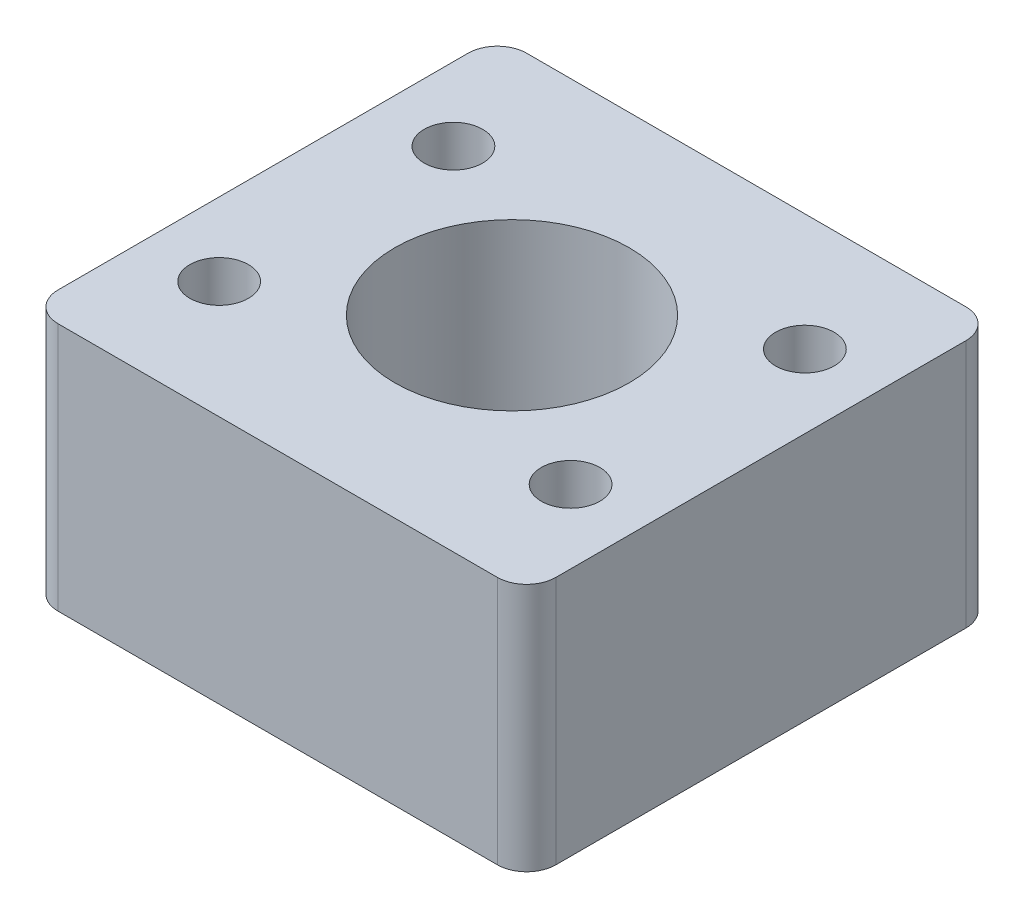
ISO-10303-21;
HEADER;
FILE_DESCRIPTION(('STEP AP214'),'2;1');
FILE_NAME('part.step','',(''),(''),'','','');
FILE_SCHEMA(('AUTOMOTIVE_DESIGN { 1 0 10303 214 1 1 1 1 }'));
ENDSEC;
DATA;
#1=APPLICATION_CONTEXT('core data for automotive mechanical design processes');
#2=APPLICATION_PROTOCOL_DEFINITION('international standard','automotive_design',2000,#1);
#3=PRODUCT_CONTEXT('',#1,'mechanical');
#4=PRODUCT('Part','Part','',(#3));
#5=PRODUCT_RELATED_PRODUCT_CATEGORY('part','',(#4));
#6=PRODUCT_DEFINITION_FORMATION('','',#4);
#7=PRODUCT_DEFINITION_CONTEXT('part definition',#1,'design');
#8=PRODUCT_DEFINITION('design','',#6,#7);
#9=PRODUCT_DEFINITION_SHAPE('','',#8);
#10=(LENGTH_UNIT() NAMED_UNIT(*) SI_UNIT(.MILLI.,.METRE.));
#11=(NAMED_UNIT(*) PLANE_ANGLE_UNIT() SI_UNIT($,.RADIAN.));
#12=(NAMED_UNIT(*) SI_UNIT($,.STERADIAN.) SOLID_ANGLE_UNIT());
#13=UNCERTAINTY_MEASURE_WITH_UNIT(LENGTH_MEASURE(1.E-05),#10,'distance_accuracy_value','');
#14=(GEOMETRIC_REPRESENTATION_CONTEXT(3) GLOBAL_UNCERTAINTY_ASSIGNED_CONTEXT((#13)) GLOBAL_UNIT_ASSIGNED_CONTEXT((#10,
#11,#12)) REPRESENTATION_CONTEXT('',''));
#15=CARTESIAN_POINT('',(0.,0.,0.));
#16=DIRECTION('',(0.,0.,1.));
#17=DIRECTION('',(1.,0.,0.));
#18=AXIS2_PLACEMENT_3D('',#15,#16,#17);
#19=CARTESIAN_POINT('',(0.,8.5,0.));
#20=DIRECTION('',(0.,-1.,0.));
#21=DIRECTION('',(0.,0.,-1.));
#22=AXIS2_PLACEMENT_3D('',#19,#20,#21);
#23=PLANE('',#22);
#24=DIRECTION('',(0.,0.,-1.));
#25=VECTOR('',#24,1.);
#26=CARTESIAN_POINT('',(8.5,8.5,8.));
#27=LINE('',#26,#25);
#28=CARTESIAN_POINT('',(8.5,8.5,7.));
#29=VERTEX_POINT('',#28);
#30=CARTESIAN_POINT('',(8.5,8.5,-7.));
#31=VERTEX_POINT('',#30);
#32=EDGE_CURVE('E144',#29,#31,#27,.T.);
#33=ORIENTED_EDGE('',*,*,#32,.T.);
#34=CARTESIAN_POINT('',(7.5,8.5,-7.));
#35=DIRECTION('',(0.,-1.,0.));
#36=DIRECTION('',(0.,0.,-1.));
#37=AXIS2_PLACEMENT_3D('',#34,#35,#36);
#38=CIRCLE('',#37,1.);
#39=CARTESIAN_POINT('',(7.5,8.5,-8.));
#40=VERTEX_POINT('',#39);
#41=EDGE_CURVE('E159',#31,#40,#38,.F.);
#42=ORIENTED_EDGE('',*,*,#41,.T.);
#43=DIRECTION('',(-1.,0.,0.));
#44=VECTOR('',#43,1.);
#45=CARTESIAN_POINT('',(-8.5,8.5,-8.));
#46=LINE('',#45,#44);
#47=CARTESIAN_POINT('',(-7.5,8.5,-8.));
#48=VERTEX_POINT('',#47);
#49=EDGE_CURVE('E126',#40,#48,#46,.T.);
#50=ORIENTED_EDGE('',*,*,#49,.T.);
#51=CARTESIAN_POINT('',(-7.5,8.5,-7.));
#52=DIRECTION('',(0.,-1.,0.));
#53=DIRECTION('',(0.,0.,-1.));
#54=AXIS2_PLACEMENT_3D('',#51,#52,#53);
#55=CIRCLE('',#54,1.);
#56=CARTESIAN_POINT('',(-8.5,8.5,-7.));
#57=VERTEX_POINT('',#56);
#58=EDGE_CURVE('E157',#48,#57,#55,.F.);
#59=ORIENTED_EDGE('',*,*,#58,.T.);
#60=DIRECTION('',(0.,0.,1.));
#61=VECTOR('',#60,1.);
#62=CARTESIAN_POINT('',(-8.5,8.5,8.));
#63=LINE('',#62,#61);
#64=CARTESIAN_POINT('',(-8.5,8.5,7.));
#65=VERTEX_POINT('',#64);
#66=EDGE_CURVE('E179',#57,#65,#63,.T.);
#67=ORIENTED_EDGE('',*,*,#66,.T.);
#68=CARTESIAN_POINT('',(-7.5,8.5,7.));
#69=DIRECTION('',(0.,-1.,0.));
#70=DIRECTION('',(0.,0.,-1.));
#71=AXIS2_PLACEMENT_3D('',#68,#69,#70);
#72=CIRCLE('',#71,1.);
#73=CARTESIAN_POINT('',(-7.5,8.5,8.));
#74=VERTEX_POINT('',#73);
#75=EDGE_CURVE('E61',#65,#74,#72,.F.);
#76=ORIENTED_EDGE('',*,*,#75,.T.);
#77=DIRECTION('',(1.,0.,0.));
#78=VECTOR('',#77,1.);
#79=CARTESIAN_POINT('',(-8.5,8.5,8.));
#80=LINE('',#79,#78);
#81=CARTESIAN_POINT('',(7.5,8.5,8.));
#82=VERTEX_POINT('',#81);
#83=EDGE_CURVE('E145',#74,#82,#80,.T.);
#84=ORIENTED_EDGE('',*,*,#83,.T.);
#85=CARTESIAN_POINT('',(7.5,8.5,7.));
#86=DIRECTION('',(0.,-1.,0.));
#87=DIRECTION('',(0.,0.,-1.));
#88=AXIS2_PLACEMENT_3D('',#85,#86,#87);
#89=CIRCLE('',#88,1.);
#90=EDGE_CURVE('E155',#82,#29,#89,.F.);
#91=ORIENTED_EDGE('',*,*,#90,.T.);
#92=EDGE_LOOP('',(#33,#42,#50,#59,#67,#76,#84,#91));
#93=FACE_BOUND('',#92,.T.);
#94=CARTESIAN_POINT('',(6.,8.5,-4.));
#95=DIRECTION('',(0.,1.,0.));
#96=DIRECTION('',(0.,0.,1.));
#97=AXIS2_PLACEMENT_3D('',#94,#95,#96);
#98=CIRCLE('',#97,1.);
#99=CARTESIAN_POINT('',(6.,8.5,-3.));
#100=VERTEX_POINT('',#99);
#101=EDGE_CURVE('E139',#100,#100,#98,.T.);
#102=ORIENTED_EDGE('',*,*,#101,.F.);
#103=EDGE_LOOP('',(#102));
#104=FACE_BOUND('',#103,.T.);
#105=CARTESIAN_POINT('',(-6.,8.5,-4.));
#106=DIRECTION('',(0.,1.,0.));
#107=DIRECTION('',(0.,0.,-1.));
#108=AXIS2_PLACEMENT_3D('',#105,#106,#107);
#109=CIRCLE('',#108,1.);
#110=CARTESIAN_POINT('',(-6.,8.5,-5.));
#111=VERTEX_POINT('',#110);
#112=EDGE_CURVE('E194',#111,#111,#109,.T.);
#113=ORIENTED_EDGE('',*,*,#112,.F.);
#114=EDGE_LOOP('',(#113));
#115=FACE_BOUND('',#114,.T.);
#116=CARTESIAN_POINT('',(6.,8.5,4.));
#117=DIRECTION('',(0.,1.,0.));
#118=DIRECTION('',(0.,0.,-1.));
#119=AXIS2_PLACEMENT_3D('',#116,#117,#118);
#120=CIRCLE('',#119,1.);
#121=CARTESIAN_POINT('',(6.,8.5,3.));
#122=VERTEX_POINT('',#121);
#123=EDGE_CURVE('E198',#122,#122,#120,.T.);
#124=ORIENTED_EDGE('',*,*,#123,.F.);
#125=EDGE_LOOP('',(#124));
#126=FACE_BOUND('',#125,.T.);
#127=CARTESIAN_POINT('',(-6.,8.5,4.));
#128=DIRECTION('',(0.,1.,0.));
#129=DIRECTION('',(0.,0.,1.));
#130=AXIS2_PLACEMENT_3D('',#127,#128,#129);
#131=CIRCLE('',#130,1.);
#132=CARTESIAN_POINT('',(-6.,8.5,5.));
#133=VERTEX_POINT('',#132);
#134=EDGE_CURVE('E202',#133,#133,#131,.T.);
#135=ORIENTED_EDGE('',*,*,#134,.F.);
#136=EDGE_LOOP('',(#135));
#137=FACE_BOUND('',#136,.T.);
#138=CARTESIAN_POINT('',(0.,8.5,0.));
#139=DIRECTION('',(0.,1.,0.));
#140=DIRECTION('',(0.,0.,1.));
#141=AXIS2_PLACEMENT_3D('',#138,#139,#140);
#142=CIRCLE('',#141,4.);
#143=CARTESIAN_POINT('',(0.,8.5,4.));
#144=VERTEX_POINT('',#143);
#145=EDGE_CURVE('E205',#144,#144,#142,.T.);
#146=ORIENTED_EDGE('',*,*,#145,.F.);
#147=EDGE_LOOP('',(#146));
#148=FACE_BOUND('',#147,.T.);
#149=ADVANCED_FACE('F41',(#93,#104,#115,#126,#137,#148),#23,.F.);
#150=CARTESIAN_POINT('',(0.,0.,0.));
#151=DIRECTION('',(0.,-1.,0.));
#152=DIRECTION('',(0.,0.,-1.));
#153=AXIS2_PLACEMENT_3D('',#150,#151,#152);
#154=PLANE('',#153);
#155=CARTESIAN_POINT('',(-6.,0.,4.));
#156=DIRECTION('',(0.,1.,0.));
#157=DIRECTION('',(0.,0.,1.));
#158=AXIS2_PLACEMENT_3D('',#155,#156,#157);
#159=CIRCLE('',#158,1.);
#160=CARTESIAN_POINT('',(-6.,0.,5.));
#161=VERTEX_POINT('',#160);
#162=EDGE_CURVE('E207',#161,#161,#159,.T.);
#163=ORIENTED_EDGE('',*,*,#162,.T.);
#164=EDGE_LOOP('',(#163));
#165=FACE_BOUND('',#164,.T.);
#166=CARTESIAN_POINT('',(-6.,0.,-4.));
#167=DIRECTION('',(0.,1.,0.));
#168=DIRECTION('',(0.,0.,-1.));
#169=AXIS2_PLACEMENT_3D('',#166,#167,#168);
#170=CIRCLE('',#169,1.);
#171=CARTESIAN_POINT('',(-6.,0.,-5.));
#172=VERTEX_POINT('',#171);
#173=EDGE_CURVE('E218',#172,#172,#170,.T.);
#174=ORIENTED_EDGE('',*,*,#173,.T.);
#175=EDGE_LOOP('',(#174));
#176=FACE_BOUND('',#175,.T.);
#177=DIRECTION('',(-1.,0.,0.));
#178=VECTOR('',#177,1.);
#179=CARTESIAN_POINT('',(-8.5,0.,-8.));
#180=LINE('',#179,#178);
#181=CARTESIAN_POINT('',(7.5,0.,-8.));
#182=VERTEX_POINT('',#181);
#183=CARTESIAN_POINT('',(-7.5,0.,-8.));
#184=VERTEX_POINT('',#183);
#185=EDGE_CURVE('E123',#182,#184,#180,.T.);
#186=ORIENTED_EDGE('',*,*,#185,.F.);
#187=CARTESIAN_POINT('',(7.5,0.,-7.));
#188=DIRECTION('',(0.,-1.,0.));
#189=DIRECTION('',(0.,0.,-1.));
#190=AXIS2_PLACEMENT_3D('',#187,#188,#189);
#191=CIRCLE('',#190,1.);
#192=CARTESIAN_POINT('',(8.5,0.,-7.));
#193=VERTEX_POINT('',#192);
#194=EDGE_CURVE('E106',#182,#193,#191,.T.);
#195=ORIENTED_EDGE('',*,*,#194,.T.);
#196=DIRECTION('',(0.,0.,-1.));
#197=VECTOR('',#196,1.);
#198=CARTESIAN_POINT('',(8.5,0.,8.));
#199=LINE('',#198,#197);
#200=CARTESIAN_POINT('',(8.5,0.,7.));
#201=VERTEX_POINT('',#200);
#202=EDGE_CURVE('E134',#201,#193,#199,.T.);
#203=ORIENTED_EDGE('',*,*,#202,.F.);
#204=CARTESIAN_POINT('',(7.5,0.,7.));
#205=DIRECTION('',(0.,-1.,0.));
#206=DIRECTION('',(0.,0.,-1.));
#207=AXIS2_PLACEMENT_3D('',#204,#205,#206);
#208=CIRCLE('',#207,1.);
#209=CARTESIAN_POINT('',(7.5,0.,8.));
#210=VERTEX_POINT('',#209);
#211=EDGE_CURVE('E148',#201,#210,#208,.T.);
#212=ORIENTED_EDGE('',*,*,#211,.T.);
#213=DIRECTION('',(1.,0.,0.));
#214=VECTOR('',#213,1.);
#215=CARTESIAN_POINT('',(-8.5,0.,8.));
#216=LINE('',#215,#214);
#217=CARTESIAN_POINT('',(-7.5,0.,8.));
#218=VERTEX_POINT('',#217);
#219=EDGE_CURVE('E137',#218,#210,#216,.T.);
#220=ORIENTED_EDGE('',*,*,#219,.F.);
#221=CARTESIAN_POINT('',(-7.5,0.,7.));
#222=DIRECTION('',(0.,-1.,0.));
#223=DIRECTION('',(0.,0.,-1.));
#224=AXIS2_PLACEMENT_3D('',#221,#222,#223);
#225=CIRCLE('',#224,1.);
#226=CARTESIAN_POINT('',(-8.5,0.,7.));
#227=VERTEX_POINT('',#226);
#228=EDGE_CURVE('E127',#218,#227,#225,.T.);
#229=ORIENTED_EDGE('',*,*,#228,.T.);
#230=DIRECTION('',(0.,0.,1.));
#231=VECTOR('',#230,1.);
#232=CARTESIAN_POINT('',(-8.5,0.,8.));
#233=LINE('',#232,#231);
#234=CARTESIAN_POINT('',(-8.5,0.,-7.));
#235=VERTEX_POINT('',#234);
#236=EDGE_CURVE('E133',#235,#227,#233,.T.);
#237=ORIENTED_EDGE('',*,*,#236,.F.);
#238=CARTESIAN_POINT('',(-7.5,0.,-7.));
#239=DIRECTION('',(0.,-1.,0.));
#240=DIRECTION('',(0.,0.,-1.));
#241=AXIS2_PLACEMENT_3D('',#238,#239,#240);
#242=CIRCLE('',#241,1.);
#243=EDGE_CURVE('E117',#235,#184,#242,.T.);
#244=ORIENTED_EDGE('',*,*,#243,.T.);
#245=EDGE_LOOP('',(#186,#195,#203,#212,#220,#229,#237,#244));
#246=FACE_BOUND('',#245,.T.);
#247=CARTESIAN_POINT('',(6.,0.,-4.));
#248=DIRECTION('',(0.,1.,0.));
#249=DIRECTION('',(0.,0.,1.));
#250=AXIS2_PLACEMENT_3D('',#247,#248,#249);
#251=CIRCLE('',#250,1.);
#252=CARTESIAN_POINT('',(6.,0.,-3.));
#253=VERTEX_POINT('',#252);
#254=EDGE_CURVE('E182',#253,#253,#251,.T.);
#255=ORIENTED_EDGE('',*,*,#254,.T.);
#256=EDGE_LOOP('',(#255));
#257=FACE_BOUND('',#256,.T.);
#258=CARTESIAN_POINT('',(6.,0.,4.));
#259=DIRECTION('',(0.,1.,0.));
#260=DIRECTION('',(0.,0.,-1.));
#261=AXIS2_PLACEMENT_3D('',#258,#259,#260);
#262=CIRCLE('',#261,1.);
#263=CARTESIAN_POINT('',(6.,0.,3.));
#264=VERTEX_POINT('',#263);
#265=EDGE_CURVE('E215',#264,#264,#262,.T.);
#266=ORIENTED_EDGE('',*,*,#265,.T.);
#267=EDGE_LOOP('',(#266));
#268=FACE_BOUND('',#267,.T.);
#269=CARTESIAN_POINT('',(0.,0.,0.));
#270=DIRECTION('',(0.,1.,0.));
#271=DIRECTION('',(0.,0.,1.));
#272=AXIS2_PLACEMENT_3D('',#269,#270,#271);
#273=CIRCLE('',#272,4.);
#274=CARTESIAN_POINT('',(0.,0.,4.));
#275=VERTEX_POINT('',#274);
#276=EDGE_CURVE('E208',#275,#275,#273,.T.);
#277=ORIENTED_EDGE('',*,*,#276,.T.);
#278=EDGE_LOOP('',(#277));
#279=FACE_BOUND('',#278,.T.);
#280=ADVANCED_FACE('F130',(#165,#176,#246,#257,#268,#279),#154,.T.);
#281=CARTESIAN_POINT('',(8.5,8.5,8.));
#282=DIRECTION('',(-1.,0.,0.));
#283=DIRECTION('',(0.,0.,1.));
#284=AXIS2_PLACEMENT_3D('',#281,#282,#283);
#285=PLANE('',#284);
#286=ORIENTED_EDGE('',*,*,#202,.T.);
#287=DIRECTION('',(0.,-1.,0.));
#288=VECTOR('',#287,1.);
#289=CARTESIAN_POINT('',(8.5,8.5,-7.));
#290=LINE('',#289,#288);
#291=EDGE_CURVE('E111',#193,#31,#290,.F.);
#292=ORIENTED_EDGE('',*,*,#291,.T.);
#293=ORIENTED_EDGE('',*,*,#32,.F.);
#294=DIRECTION('',(0.,-1.,0.));
#295=VECTOR('',#294,1.);
#296=CARTESIAN_POINT('',(8.5,8.5,7.));
#297=LINE('',#296,#295);
#298=EDGE_CURVE('E116',#29,#201,#297,.T.);
#299=ORIENTED_EDGE('',*,*,#298,.T.);
#300=EDGE_LOOP('',(#286,#292,#293,#299));
#301=FACE_BOUND('',#300,.T.);
#302=ADVANCED_FACE('F176',(#301),#285,.F.);
#303=CARTESIAN_POINT('',(-8.5,8.5,-8.));
#304=DIRECTION('',(0.,0.,1.));
#305=DIRECTION('',(1.,0.,0.));
#306=AXIS2_PLACEMENT_3D('',#303,#304,#305);
#307=PLANE('',#306);
#308=ORIENTED_EDGE('',*,*,#49,.F.);
#309=DIRECTION('',(0.,-1.,0.));
#310=VECTOR('',#309,1.);
#311=CARTESIAN_POINT('',(7.5,8.5,-8.));
#312=LINE('',#311,#310);
#313=EDGE_CURVE('E110',#40,#182,#312,.T.);
#314=ORIENTED_EDGE('',*,*,#313,.T.);
#315=ORIENTED_EDGE('',*,*,#185,.T.);
#316=DIRECTION('',(0.,-1.,0.));
#317=VECTOR('',#316,1.);
#318=CARTESIAN_POINT('',(-7.5,8.5,-8.));
#319=LINE('',#318,#317);
#320=EDGE_CURVE('E128',#184,#48,#319,.F.);
#321=ORIENTED_EDGE('',*,*,#320,.T.);
#322=EDGE_LOOP('',(#308,#314,#315,#321));
#323=FACE_BOUND('',#322,.T.);
#324=ADVANCED_FACE('F122',(#323),#307,.F.);
#325=CARTESIAN_POINT('',(-8.5,8.5,8.));
#326=DIRECTION('',(1.,0.,0.));
#327=DIRECTION('',(0.,0.,-1.));
#328=AXIS2_PLACEMENT_3D('',#325,#326,#327);
#329=PLANE('',#328);
#330=ORIENTED_EDGE('',*,*,#66,.F.);
#331=DIRECTION('',(0.,-1.,0.));
#332=VECTOR('',#331,1.);
#333=CARTESIAN_POINT('',(-8.5,8.5,-7.));
#334=LINE('',#333,#332);
#335=EDGE_CURVE('E163',#57,#235,#334,.T.);
#336=ORIENTED_EDGE('',*,*,#335,.T.);
#337=ORIENTED_EDGE('',*,*,#236,.T.);
#338=DIRECTION('',(0.,-1.,0.));
#339=VECTOR('',#338,1.);
#340=CARTESIAN_POINT('',(-8.5,8.5,7.));
#341=LINE('',#340,#339);
#342=EDGE_CURVE('E161',#227,#65,#341,.F.);
#343=ORIENTED_EDGE('',*,*,#342,.T.);
#344=EDGE_LOOP('',(#330,#336,#337,#343));
#345=FACE_BOUND('',#344,.T.);
#346=ADVANCED_FACE('F239',(#345),#329,.F.);
#347=CARTESIAN_POINT('',(-8.5,8.5,8.));
#348=DIRECTION('',(0.,0.,-1.));
#349=DIRECTION('',(-1.,0.,0.));
#350=AXIS2_PLACEMENT_3D('',#347,#348,#349);
#351=PLANE('',#350);
#352=ORIENTED_EDGE('',*,*,#219,.T.);
#353=DIRECTION('',(0.,-1.,0.));
#354=VECTOR('',#353,1.);
#355=CARTESIAN_POINT('',(7.5,8.5,8.));
#356=LINE('',#355,#354);
#357=EDGE_CURVE('E11',#210,#82,#356,.F.);
#358=ORIENTED_EDGE('',*,*,#357,.T.);
#359=ORIENTED_EDGE('',*,*,#83,.F.);
#360=DIRECTION('',(0.,-1.,0.));
#361=VECTOR('',#360,1.);
#362=CARTESIAN_POINT('',(-7.5,8.5,8.));
#363=LINE('',#362,#361);
#364=EDGE_CURVE('E49',#74,#218,#363,.T.);
#365=ORIENTED_EDGE('',*,*,#364,.T.);
#366=EDGE_LOOP('',(#352,#358,#359,#365));
#367=FACE_BOUND('',#366,.T.);
#368=ADVANCED_FACE('F168',(#367),#351,.F.);
#369=CARTESIAN_POINT('',(6.,8.5,-4.));
#370=DIRECTION('',(0.,-1.,0.));
#371=DIRECTION('',(0.,0.,-1.));
#372=AXIS2_PLACEMENT_3D('',#369,#370,#371);
#373=CYLINDRICAL_SURFACE('',#372,1.);
#374=ORIENTED_EDGE('',*,*,#101,.T.);
#375=EDGE_LOOP('',(#374));
#376=FACE_BOUND('',#375,.T.);
#377=ORIENTED_EDGE('',*,*,#254,.F.);
#378=EDGE_LOOP('',(#377));
#379=FACE_BOUND('',#378,.T.);
#380=ADVANCED_FACE('F228',(#376,#379),#373,.F.);
#381=CARTESIAN_POINT('',(-6.,8.5,-4.));
#382=DIRECTION('',(0.,-1.,0.));
#383=DIRECTION('',(0.,0.,-1.));
#384=AXIS2_PLACEMENT_3D('',#381,#382,#383);
#385=CYLINDRICAL_SURFACE('',#384,1.);
#386=ORIENTED_EDGE('',*,*,#112,.T.);
#387=EDGE_LOOP('',(#386));
#388=FACE_BOUND('',#387,.T.);
#389=ORIENTED_EDGE('',*,*,#173,.F.);
#390=EDGE_LOOP('',(#389));
#391=FACE_BOUND('',#390,.T.);
#392=ADVANCED_FACE('F230',(#388,#391),#385,.F.);
#393=CARTESIAN_POINT('',(6.,8.5,4.));
#394=DIRECTION('',(0.,-1.,0.));
#395=DIRECTION('',(0.,0.,-1.));
#396=AXIS2_PLACEMENT_3D('',#393,#394,#395);
#397=CYLINDRICAL_SURFACE('',#396,1.);
#398=ORIENTED_EDGE('',*,*,#123,.T.);
#399=EDGE_LOOP('',(#398));
#400=FACE_BOUND('',#399,.T.);
#401=ORIENTED_EDGE('',*,*,#265,.F.);
#402=EDGE_LOOP('',(#401));
#403=FACE_BOUND('',#402,.T.);
#404=ADVANCED_FACE('F235',(#400,#403),#397,.F.);
#405=CARTESIAN_POINT('',(-6.,8.5,4.));
#406=DIRECTION('',(0.,-1.,0.));
#407=DIRECTION('',(0.,0.,-1.));
#408=AXIS2_PLACEMENT_3D('',#405,#406,#407);
#409=CYLINDRICAL_SURFACE('',#408,1.);
#410=ORIENTED_EDGE('',*,*,#134,.T.);
#411=EDGE_LOOP('',(#410));
#412=FACE_BOUND('',#411,.T.);
#413=ORIENTED_EDGE('',*,*,#162,.F.);
#414=EDGE_LOOP('',(#413));
#415=FACE_BOUND('',#414,.T.);
#416=ADVANCED_FACE('F295',(#412,#415),#409,.F.);
#417=CARTESIAN_POINT('',(0.,8.5,0.));
#418=DIRECTION('',(0.,-1.,0.));
#419=DIRECTION('',(0.,0.,-1.));
#420=AXIS2_PLACEMENT_3D('',#417,#418,#419);
#421=CYLINDRICAL_SURFACE('',#420,4.);
#422=ORIENTED_EDGE('',*,*,#145,.T.);
#423=EDGE_LOOP('',(#422));
#424=FACE_BOUND('',#423,.T.);
#425=ORIENTED_EDGE('',*,*,#276,.F.);
#426=EDGE_LOOP('',(#425));
#427=FACE_BOUND('',#426,.T.);
#428=ADVANCED_FACE('F256',(#424,#427),#421,.F.);
#429=CARTESIAN_POINT('',(7.5,8.5,-7.));
#430=DIRECTION('',(0.,-1.,0.));
#431=DIRECTION('',(0.,0.,-1.));
#432=AXIS2_PLACEMENT_3D('',#429,#430,#431);
#433=CYLINDRICAL_SURFACE('',#432,1.);
#434=ORIENTED_EDGE('',*,*,#41,.F.);
#435=ORIENTED_EDGE('',*,*,#291,.F.);
#436=ORIENTED_EDGE('',*,*,#194,.F.);
#437=ORIENTED_EDGE('',*,*,#313,.F.);
#438=EDGE_LOOP('',(#434,#435,#436,#437));
#439=FACE_BOUND('',#438,.T.);
#440=ADVANCED_FACE('F109',(#439),#433,.T.);
#441=CARTESIAN_POINT('',(-7.5,8.5,-7.));
#442=DIRECTION('',(0.,-1.,0.));
#443=DIRECTION('',(0.,0.,-1.));
#444=AXIS2_PLACEMENT_3D('',#441,#442,#443);
#445=CYLINDRICAL_SURFACE('',#444,1.);
#446=ORIENTED_EDGE('',*,*,#58,.F.);
#447=ORIENTED_EDGE('',*,*,#320,.F.);
#448=ORIENTED_EDGE('',*,*,#243,.F.);
#449=ORIENTED_EDGE('',*,*,#335,.F.);
#450=EDGE_LOOP('',(#446,#447,#448,#449));
#451=FACE_BOUND('',#450,.T.);
#452=ADVANCED_FACE('F255',(#451),#445,.T.);
#453=CARTESIAN_POINT('',(7.5,8.5,7.));
#454=DIRECTION('',(0.,-1.,0.));
#455=DIRECTION('',(0.,0.,-1.));
#456=AXIS2_PLACEMENT_3D('',#453,#454,#455);
#457=CYLINDRICAL_SURFACE('',#456,1.);
#458=ORIENTED_EDGE('',*,*,#90,.F.);
#459=ORIENTED_EDGE('',*,*,#357,.F.);
#460=ORIENTED_EDGE('',*,*,#211,.F.);
#461=ORIENTED_EDGE('',*,*,#298,.F.);
#462=EDGE_LOOP('',(#458,#459,#460,#461));
#463=FACE_BOUND('',#462,.T.);
#464=ADVANCED_FACE('F173',(#463),#457,.T.);
#465=CARTESIAN_POINT('',(-7.5,8.5,7.));
#466=DIRECTION('',(0.,-1.,0.));
#467=DIRECTION('',(0.,0.,-1.));
#468=AXIS2_PLACEMENT_3D('',#465,#466,#467);
#469=CYLINDRICAL_SURFACE('',#468,1.);
#470=ORIENTED_EDGE('',*,*,#75,.F.);
#471=ORIENTED_EDGE('',*,*,#342,.F.);
#472=ORIENTED_EDGE('',*,*,#228,.F.);
#473=ORIENTED_EDGE('',*,*,#364,.F.);
#474=EDGE_LOOP('',(#470,#471,#472,#473));
#475=FACE_BOUND('',#474,.T.);
#476=ADVANCED_FACE('F43',(#475),#469,.T.);
#477=CLOSED_SHELL('',(#149,#280,#302,#324,#346,#368,#380,#392,#404,#416,#428,#440,#452,#464,#476));
#478=MANIFOLD_SOLID_BREP('B2',#477);
#479=ADVANCED_BREP_SHAPE_REPRESENTATION('',(#18,#478),#14);
#480=SHAPE_DEFINITION_REPRESENTATION(#9,#479);
ENDSEC;
END-ISO-10303-21;
